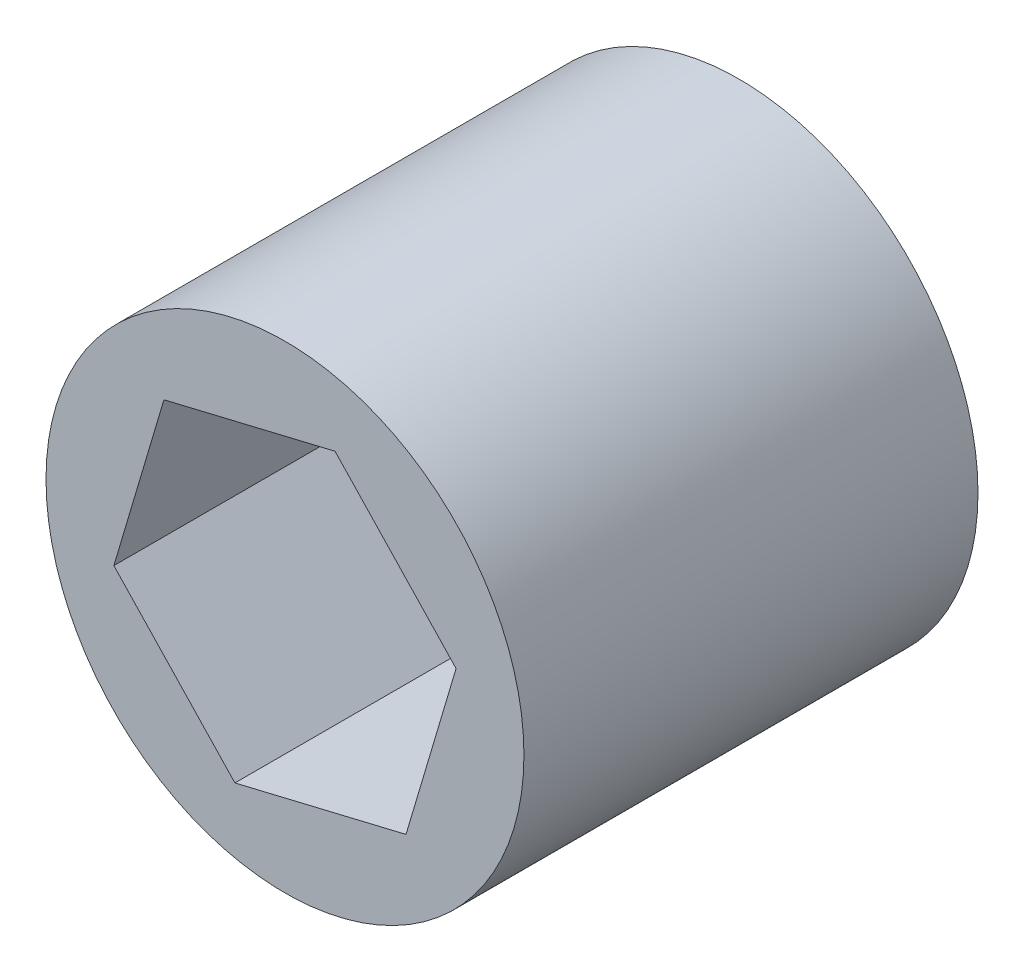
ISO-10303-21;
HEADER;
FILE_DESCRIPTION(('STEP AP214'),'2;1');
FILE_NAME('part.step','',(''),(''),'','','');
FILE_SCHEMA(('AUTOMOTIVE_DESIGN { 1 0 10303 214 1 1 1 1 }'));
ENDSEC;
DATA;
#1=APPLICATION_CONTEXT('core data for automotive mechanical design processes');
#2=APPLICATION_PROTOCOL_DEFINITION('international standard','automotive_design',2000,#1);
#3=PRODUCT_CONTEXT('',#1,'mechanical');
#4=PRODUCT('Part','Part','',(#3));
#5=PRODUCT_RELATED_PRODUCT_CATEGORY('part','',(#4));
#6=PRODUCT_DEFINITION_FORMATION('','',#4);
#7=PRODUCT_DEFINITION_CONTEXT('part definition',#1,'design');
#8=PRODUCT_DEFINITION('design','',#6,#7);
#9=PRODUCT_DEFINITION_SHAPE('','',#8);
#10=(LENGTH_UNIT() NAMED_UNIT(*) SI_UNIT(.MILLI.,.METRE.));
#11=(NAMED_UNIT(*) PLANE_ANGLE_UNIT() SI_UNIT($,.RADIAN.));
#12=(NAMED_UNIT(*) SI_UNIT($,.STERADIAN.) SOLID_ANGLE_UNIT());
#13=UNCERTAINTY_MEASURE_WITH_UNIT(LENGTH_MEASURE(1.E-05),#10,'distance_accuracy_value','');
#14=(GEOMETRIC_REPRESENTATION_CONTEXT(3) GLOBAL_UNCERTAINTY_ASSIGNED_CONTEXT((#13)) GLOBAL_UNIT_ASSIGNED_CONTEXT((#10,
#11,#12)) REPRESENTATION_CONTEXT('',''));
#15=CARTESIAN_POINT('',(0.,0.,0.));
#16=DIRECTION('',(0.,0.,1.));
#17=DIRECTION('',(1.,0.,0.));
#18=AXIS2_PLACEMENT_3D('',#15,#16,#17);
#19=CARTESIAN_POINT('',(11.,20.,16.8));
#20=DIRECTION('',(0.,0.,-1.));
#21=DIRECTION('',(1.,0.,0.));
#22=AXIS2_PLACEMENT_3D('',#19,#20,#21);
#23=CYLINDRICAL_SURFACE('',#22,2.);
#24=CARTESIAN_POINT('',(11.,20.,16.8));
#25=DIRECTION('',(0.,0.,-1.));
#26=DIRECTION('',(-1.,0.,0.));
#27=AXIS2_PLACEMENT_3D('',#24,#25,#26);
#28=CIRCLE('',#27,2.);
#29=CARTESIAN_POINT('',(9.,20.,16.8));
#30=VERTEX_POINT('',#29);
#31=EDGE_CURVE('E11',#30,#30,#28,.T.);
#32=ORIENTED_EDGE('',*,*,#31,.T.);
#33=EDGE_LOOP('',(#32));
#34=FACE_BOUND('',#33,.T.);
#35=CARTESIAN_POINT('',(11.,20.,13.));
#36=DIRECTION('',(0.,0.,-1.));
#37=DIRECTION('',(-1.,0.,0.));
#38=AXIS2_PLACEMENT_3D('',#35,#36,#37);
#39=CIRCLE('',#38,2.);
#40=CARTESIAN_POINT('',(9.,20.,13.));
#41=VERTEX_POINT('',#40);
#42=EDGE_CURVE('E20',#41,#41,#39,.T.);
#43=ORIENTED_EDGE('',*,*,#42,.F.);
#44=EDGE_LOOP('',(#43));
#45=FACE_BOUND('',#44,.T.);
#46=ADVANCED_FACE('F17',(#34,#45),#23,.T.);
#47=CARTESIAN_POINT('',(11.,20.,16.8));
#48=DIRECTION('',(0.,0.,1.));
#49=DIRECTION('',(-1.,0.,0.));
#50=AXIS2_PLACEMENT_3D('',#47,#48,#49);
#51=PLANE('',#50);
#52=DIRECTION('',(-0.972498349846841,-0.232909766959593,0.));
#53=VECTOR('',#52,1.);
#54=CARTESIAN_POINT('',(12.0129947537017,18.9313480783614,16.8));
#55=LINE('',#54,#53);
#56=CARTESIAN_POINT('',(12.0129947537017,18.9313480783614,16.8));
#57=VERTEX_POINT('',#56);
#58=CARTESIAN_POINT('',(10.5810176649088,18.5883948485747,16.8));
#59=VERTEX_POINT('',#58);
#60=EDGE_CURVE('E150',#57,#59,#55,.T.);
#61=ORIENTED_EDGE('',*,*,#60,.T.);
#62=DIRECTION('',(-0.687954949899941,0.725753392626014,0.));
#63=VECTOR('',#62,1.);
#64=CARTESIAN_POINT('',(10.5810176649088,18.5883948485747,16.8));
#65=LINE('',#64,#63);
#66=CARTESIAN_POINT('',(9.56802291120707,19.6570467702132,16.8));
#67=VERTEX_POINT('',#66);
#68=EDGE_CURVE('E154',#59,#67,#65,.T.);
#69=ORIENTED_EDGE('',*,*,#68,.T.);
#70=DIRECTION('',(0.284543399946898,0.958663159585607,0.));
#71=VECTOR('',#70,1.);
#72=CARTESIAN_POINT('',(9.56802291120707,19.6570467702132,16.8));
#73=LINE('',#72,#71);
#74=CARTESIAN_POINT('',(9.98700524629831,21.0686519216386,16.8));
#75=VERTEX_POINT('',#74);
#76=EDGE_CURVE('E158',#67,#75,#73,.T.);
#77=ORIENTED_EDGE('',*,*,#76,.T.);
#78=DIRECTION('',(0.97249834984684,0.232909766959595,0.));
#79=VECTOR('',#78,1.);
#80=CARTESIAN_POINT('',(9.98700524629831,21.0686519216386,16.8));
#81=LINE('',#80,#79);
#82=CARTESIAN_POINT('',(11.4189823350912,21.4116051514253,16.8));
#83=VERTEX_POINT('',#82);
#84=EDGE_CURVE('E162',#75,#83,#81,.T.);
#85=ORIENTED_EDGE('',*,*,#84,.T.);
#86=DIRECTION('',(0.687954949899941,-0.725753392626014,0.));
#87=VECTOR('',#86,1.);
#88=CARTESIAN_POINT('',(11.4189823350912,21.4116051514253,16.8));
#89=LINE('',#88,#87);
#90=CARTESIAN_POINT('',(12.4319770887929,20.3429532297868,16.8));
#91=VERTEX_POINT('',#90);
#92=EDGE_CURVE('E124',#83,#91,#89,.T.);
#93=ORIENTED_EDGE('',*,*,#92,.T.);
#94=DIRECTION('',(-0.284543399946899,-0.958663159585607,0.));
#95=VECTOR('',#94,1.);
#96=CARTESIAN_POINT('',(12.4319770887929,20.3429532297868,16.8));
#97=LINE('',#96,#95);
#98=EDGE_CURVE('E167',#91,#57,#97,.T.);
#99=ORIENTED_EDGE('',*,*,#98,.T.);
#100=EDGE_LOOP('',(#61,#69,#77,#85,#93,#99));
#101=FACE_BOUND('',#100,.T.);
#102=ORIENTED_EDGE('',*,*,#31,.F.);
#103=EDGE_LOOP('',(#102));
#104=FACE_BOUND('',#103,.T.);
#105=ADVANCED_FACE('F181',(#101,#104),#51,.T.);
#106=CARTESIAN_POINT('',(11.,20.,13.));
#107=DIRECTION('',(0.,0.,1.));
#108=DIRECTION('',(-1.,0.,0.));
#109=AXIS2_PLACEMENT_3D('',#106,#107,#108);
#110=PLANE('',#109);
#111=ORIENTED_EDGE('',*,*,#42,.T.);
#112=EDGE_LOOP('',(#111));
#113=FACE_BOUND('',#112,.T.);
#114=ADVANCED_FACE('F178',(#113),#110,.F.);
#115=CARTESIAN_POINT('',(12.0129947537017,18.9313480783614,14.8));
#116=DIRECTION('',(0.232909766959593,-0.972498349846841,0.));
#117=DIRECTION('',(0.972498349846841,0.232909766959593,0.));
#118=AXIS2_PLACEMENT_3D('',#115,#116,#117);
#119=PLANE('',#118);
#120=ORIENTED_EDGE('',*,*,#60,.F.);
#121=DIRECTION('',(0.,0.,1.));
#122=VECTOR('',#121,1.);
#123=CARTESIAN_POINT('',(12.0129947537017,18.9313480783614,14.8));
#124=LINE('',#123,#122);
#125=CARTESIAN_POINT('',(12.0129947537017,18.9313480783614,14.8));
#126=VERTEX_POINT('',#125);
#127=EDGE_CURVE('E82',#126,#57,#124,.T.);
#128=ORIENTED_EDGE('',*,*,#127,.F.);
#129=DIRECTION('',(-0.972498349846841,-0.232909766959593,0.));
#130=VECTOR('',#129,1.);
#131=CARTESIAN_POINT('',(12.0129947537017,18.9313480783614,14.8));
#132=LINE('',#131,#130);
#133=CARTESIAN_POINT('',(10.5810176649088,18.5883948485747,14.8));
#134=VERTEX_POINT('',#133);
#135=EDGE_CURVE('E168',#126,#134,#132,.T.);
#136=ORIENTED_EDGE('',*,*,#135,.T.);
#137=DIRECTION('',(0.,0.,1.));
#138=VECTOR('',#137,1.);
#139=CARTESIAN_POINT('',(10.5810176649088,18.5883948485747,14.8));
#140=LINE('',#139,#138);
#141=EDGE_CURVE('E38',#134,#59,#140,.T.);
#142=ORIENTED_EDGE('',*,*,#141,.T.);
#143=EDGE_LOOP('',(#120,#128,#136,#142));
#144=FACE_BOUND('',#143,.T.);
#145=ADVANCED_FACE('F194',(#144),#119,.F.);
#146=CARTESIAN_POINT('',(12.4319770887929,20.3429532297868,14.8));
#147=DIRECTION('',(0.958663159585607,-0.284543399946899,0.));
#148=DIRECTION('',(0.284543399946899,0.958663159585607,0.));
#149=AXIS2_PLACEMENT_3D('',#146,#147,#148);
#150=PLANE('',#149);
#151=ORIENTED_EDGE('',*,*,#98,.F.);
#152=DIRECTION('',(0.,0.,1.));
#153=VECTOR('',#152,1.);
#154=CARTESIAN_POINT('',(12.4319770887929,20.3429532297868,14.8));
#155=LINE('',#154,#153);
#156=CARTESIAN_POINT('',(12.4319770887929,20.3429532297868,14.8));
#157=VERTEX_POINT('',#156);
#158=EDGE_CURVE('E127',#157,#91,#155,.T.);
#159=ORIENTED_EDGE('',*,*,#158,.F.);
#160=DIRECTION('',(-0.284543399946899,-0.958663159585607,0.));
#161=VECTOR('',#160,1.);
#162=CARTESIAN_POINT('',(12.4319770887929,20.3429532297868,14.8));
#163=LINE('',#162,#161);
#164=EDGE_CURVE('E52',#157,#126,#163,.T.);
#165=ORIENTED_EDGE('',*,*,#164,.T.);
#166=ORIENTED_EDGE('',*,*,#127,.T.);
#167=EDGE_LOOP('',(#151,#159,#165,#166));
#168=FACE_BOUND('',#167,.T.);
#169=ADVANCED_FACE('F198',(#168),#150,.F.);
#170=CARTESIAN_POINT('',(11.4189823350912,21.4116051514253,14.8));
#171=DIRECTION('',(0.725753392626014,0.687954949899941,0.));
#172=DIRECTION('',(-0.687954949899941,0.725753392626014,0.));
#173=AXIS2_PLACEMENT_3D('',#170,#171,#172);
#174=PLANE('',#173);
#175=ORIENTED_EDGE('',*,*,#92,.F.);
#176=DIRECTION('',(0.,0.,1.));
#177=VECTOR('',#176,1.);
#178=CARTESIAN_POINT('',(11.4189823350912,21.4116051514253,14.8));
#179=LINE('',#178,#177);
#180=CARTESIAN_POINT('',(11.4189823350912,21.4116051514253,14.8));
#181=VERTEX_POINT('',#180);
#182=EDGE_CURVE('E111',#181,#83,#179,.T.);
#183=ORIENTED_EDGE('',*,*,#182,.F.);
#184=DIRECTION('',(0.687954949899941,-0.725753392626014,0.));
#185=VECTOR('',#184,1.);
#186=CARTESIAN_POINT('',(11.4189823350912,21.4116051514253,14.8));
#187=LINE('',#186,#185);
#188=EDGE_CURVE('E115',#181,#157,#187,.T.);
#189=ORIENTED_EDGE('',*,*,#188,.T.);
#190=ORIENTED_EDGE('',*,*,#158,.T.);
#191=EDGE_LOOP('',(#175,#183,#189,#190));
#192=FACE_BOUND('',#191,.T.);
#193=ADVANCED_FACE('F122',(#192),#174,.F.);
#194=CARTESIAN_POINT('',(9.98700524629831,21.0686519216386,14.8));
#195=DIRECTION('',(-0.232909766959595,0.97249834984684,0.));
#196=DIRECTION('',(-0.97249834984684,-0.232909766959595,0.));
#197=AXIS2_PLACEMENT_3D('',#194,#195,#196);
#198=PLANE('',#197);
#199=ORIENTED_EDGE('',*,*,#84,.F.);
#200=DIRECTION('',(0.,0.,1.));
#201=VECTOR('',#200,1.);
#202=CARTESIAN_POINT('',(9.98700524629831,21.0686519216386,14.8));
#203=LINE('',#202,#201);
#204=CARTESIAN_POINT('',(9.98700524629831,21.0686519216386,14.8));
#205=VERTEX_POINT('',#204);
#206=EDGE_CURVE('E113',#205,#75,#203,.T.);
#207=ORIENTED_EDGE('',*,*,#206,.F.);
#208=DIRECTION('',(0.97249834984684,0.232909766959595,0.));
#209=VECTOR('',#208,1.);
#210=CARTESIAN_POINT('',(9.98700524629831,21.0686519216386,14.8));
#211=LINE('',#210,#209);
#212=EDGE_CURVE('E106',#205,#181,#211,.T.);
#213=ORIENTED_EDGE('',*,*,#212,.T.);
#214=ORIENTED_EDGE('',*,*,#182,.T.);
#215=EDGE_LOOP('',(#199,#207,#213,#214));
#216=FACE_BOUND('',#215,.T.);
#217=ADVANCED_FACE('F109',(#216),#198,.F.);
#218=CARTESIAN_POINT('',(9.56802291120707,19.6570467702132,14.8));
#219=DIRECTION('',(-0.958663159585607,0.284543399946898,0.));
#220=DIRECTION('',(-0.284543399946899,-0.958663159585607,0.));
#221=AXIS2_PLACEMENT_3D('',#218,#219,#220);
#222=PLANE('',#221);
#223=ORIENTED_EDGE('',*,*,#76,.F.);
#224=DIRECTION('',(0.,0.,1.));
#225=VECTOR('',#224,1.);
#226=CARTESIAN_POINT('',(9.56802291120707,19.6570467702132,14.8));
#227=LINE('',#226,#225);
#228=CARTESIAN_POINT('',(9.56802291120707,19.6570467702132,14.8));
#229=VERTEX_POINT('',#228);
#230=EDGE_CURVE('E135',#229,#67,#227,.T.);
#231=ORIENTED_EDGE('',*,*,#230,.F.);
#232=DIRECTION('',(0.284543399946898,0.958663159585607,0.));
#233=VECTOR('',#232,1.);
#234=CARTESIAN_POINT('',(9.56802291120707,19.6570467702132,14.8));
#235=LINE('',#234,#233);
#236=EDGE_CURVE('E116',#229,#205,#235,.T.);
#237=ORIENTED_EDGE('',*,*,#236,.T.);
#238=ORIENTED_EDGE('',*,*,#206,.T.);
#239=EDGE_LOOP('',(#223,#231,#237,#238));
#240=FACE_BOUND('',#239,.T.);
#241=ADVANCED_FACE('F202',(#240),#222,.F.);
#242=CARTESIAN_POINT('',(10.5810176649088,18.5883948485747,14.8));
#243=DIRECTION('',(-0.725753392626014,-0.687954949899941,0.));
#244=DIRECTION('',(0.687954949899941,-0.725753392626014,0.));
#245=AXIS2_PLACEMENT_3D('',#242,#243,#244);
#246=PLANE('',#245);
#247=ORIENTED_EDGE('',*,*,#68,.F.);
#248=ORIENTED_EDGE('',*,*,#141,.F.);
#249=DIRECTION('',(-0.687954949899941,0.725753392626014,0.));
#250=VECTOR('',#249,1.);
#251=CARTESIAN_POINT('',(10.5810176649088,18.5883948485747,14.8));
#252=LINE('',#251,#250);
#253=EDGE_CURVE('E93',#134,#229,#252,.T.);
#254=ORIENTED_EDGE('',*,*,#253,.T.);
#255=ORIENTED_EDGE('',*,*,#230,.T.);
#256=EDGE_LOOP('',(#247,#248,#254,#255));
#257=FACE_BOUND('',#256,.T.);
#258=ADVANCED_FACE('F199',(#257),#246,.F.);
#259=CARTESIAN_POINT('',(10.5810176649088,18.5883948485747,14.8));
#260=DIRECTION('',(0.,0.,1.));
#261=DIRECTION('',(-1.,0.,0.));
#262=AXIS2_PLACEMENT_3D('',#259,#260,#261);
#263=PLANE('',#262);
#264=ORIENTED_EDGE('',*,*,#135,.F.);
#265=ORIENTED_EDGE('',*,*,#164,.F.);
#266=ORIENTED_EDGE('',*,*,#188,.F.);
#267=ORIENTED_EDGE('',*,*,#212,.F.);
#268=ORIENTED_EDGE('',*,*,#236,.F.);
#269=ORIENTED_EDGE('',*,*,#253,.F.);
#270=EDGE_LOOP('',(#264,#265,#266,#267,#268,#269));
#271=FACE_BOUND('',#270,.T.);
#272=ADVANCED_FACE('F118',(#271),#263,.T.);
#273=CLOSED_SHELL('',(#46,#105,#114,#145,#169,#193,#217,#241,#258,#272));
#274=MANIFOLD_SOLID_BREP('B1',#273);
#275=ADVANCED_BREP_SHAPE_REPRESENTATION('',(#18,#274),#14);
#276=SHAPE_DEFINITION_REPRESENTATION(#9,#275);
ENDSEC;
END-ISO-10303-21;
